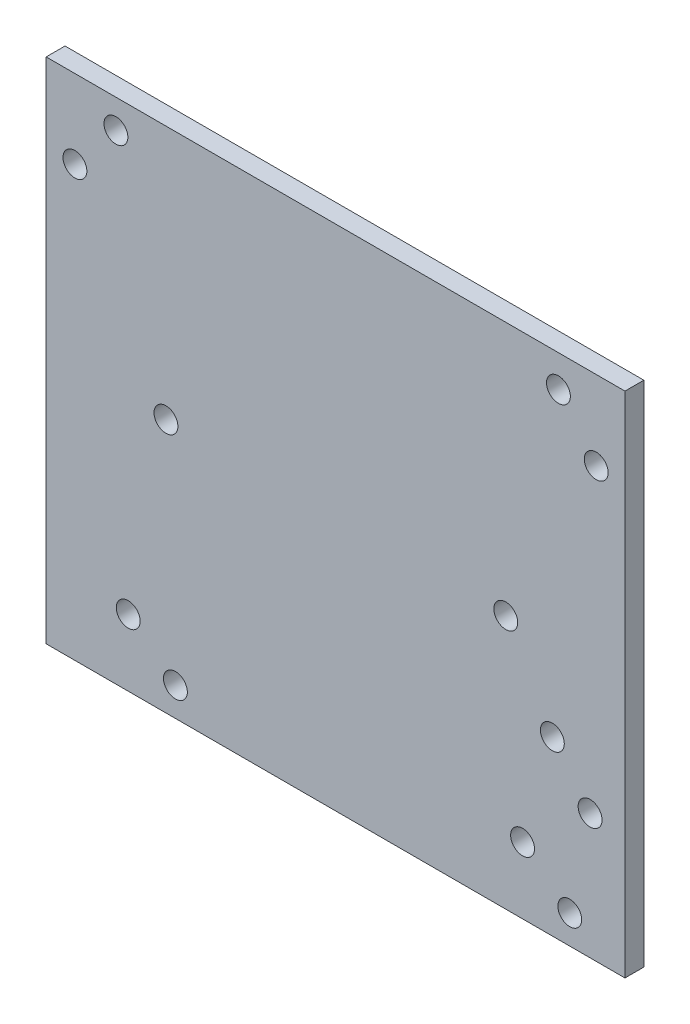
ISO-10303-21;
HEADER;
FILE_DESCRIPTION(('STEP AP214'),'2;1');
FILE_NAME('part.step','',(''),(''),'','','');
FILE_SCHEMA(('AUTOMOTIVE_DESIGN { 1 0 10303 214 1 1 1 1 }'));
ENDSEC;
DATA;
#1=APPLICATION_CONTEXT('core data for automotive mechanical design processes');
#2=APPLICATION_PROTOCOL_DEFINITION('international standard','automotive_design',2000,#1);
#3=PRODUCT_CONTEXT('',#1,'mechanical');
#4=PRODUCT('Part','Part','',(#3));
#5=PRODUCT_RELATED_PRODUCT_CATEGORY('part','',(#4));
#6=PRODUCT_DEFINITION_FORMATION('','',#4);
#7=PRODUCT_DEFINITION_CONTEXT('part definition',#1,'design');
#8=PRODUCT_DEFINITION('design','',#6,#7);
#9=PRODUCT_DEFINITION_SHAPE('','',#8);
#10=(LENGTH_UNIT() NAMED_UNIT(*) SI_UNIT(.MILLI.,.METRE.));
#11=(NAMED_UNIT(*) PLANE_ANGLE_UNIT() SI_UNIT($,.RADIAN.));
#12=(NAMED_UNIT(*) SI_UNIT($,.STERADIAN.) SOLID_ANGLE_UNIT());
#13=UNCERTAINTY_MEASURE_WITH_UNIT(LENGTH_MEASURE(1.E-05),#10,'distance_accuracy_value','');
#14=(GEOMETRIC_REPRESENTATION_CONTEXT(3) GLOBAL_UNCERTAINTY_ASSIGNED_CONTEXT((#13)) GLOBAL_UNIT_ASSIGNED_CONTEXT((#10,
#11,#12)) REPRESENTATION_CONTEXT('',''));
#15=CARTESIAN_POINT('',(0.,0.,0.));
#16=DIRECTION('',(0.,0.,1.));
#17=DIRECTION('',(1.,0.,0.));
#18=AXIS2_PLACEMENT_3D('',#15,#16,#17);
#19=CARTESIAN_POINT('',(0.,0.,-6.35));
#20=DIRECTION('',(0.,0.,1.));
#21=DIRECTION('',(-1.,0.,0.));
#22=AXIS2_PLACEMENT_3D('',#19,#20,#21);
#23=PLANE('',#22);
#24=DIRECTION('',(0.,-1.,0.));
#25=VECTOR('',#24,1.);
#26=CARTESIAN_POINT('',(862.044789876079,217.278265585855,-6.35));
#27=LINE('',#26,#25);
#28=CARTESIAN_POINT('',(862.044789876079,388.233207524856,-6.35));
#29=VERTEX_POINT('',#28);
#30=CARTESIAN_POINT('',(862.044789876079,217.278265585855,-6.35));
#31=VERTEX_POINT('',#30);
#32=EDGE_CURVE('E97',#29,#31,#27,.T.);
#33=ORIENTED_EDGE('',*,*,#32,.F.);
#34=DIRECTION('',(-1.,0.,0.));
#35=VECTOR('',#34,1.);
#36=CARTESIAN_POINT('',(862.044789876079,388.233207524856,-6.35));
#37=LINE('',#36,#35);
#38=CARTESIAN_POINT('',(1056.7178425293,388.233207524856,-6.35));
#39=VERTEX_POINT('',#38);
#40=EDGE_CURVE('E100',#39,#29,#37,.T.);
#41=ORIENTED_EDGE('',*,*,#40,.F.);
#42=DIRECTION('',(0.,1.,0.));
#43=VECTOR('',#42,1.);
#44=CARTESIAN_POINT('',(1056.7178425293,217.278265585855,-6.35));
#45=LINE('',#44,#43);
#46=CARTESIAN_POINT('',(1056.7178425293,217.278265585855,-6.35));
#47=VERTEX_POINT('',#46);
#48=EDGE_CURVE('E88',#47,#39,#45,.T.);
#49=ORIENTED_EDGE('',*,*,#48,.F.);
#50=DIRECTION('',(1.,0.,0.));
#51=VECTOR('',#50,1.);
#52=CARTESIAN_POINT('',(862.044789876079,217.278265585855,-6.35));
#53=LINE('',#52,#51);
#54=EDGE_CURVE('E93',#31,#47,#53,.T.);
#55=ORIENTED_EDGE('',*,*,#54,.F.);
#56=EDGE_LOOP('',(#33,#41,#49,#55));
#57=FACE_BOUND('',#56,.T.);
#58=CARTESIAN_POINT('',(1022.27995941321,239.653265585854,-6.35));
#59=DIRECTION('',(0.,0.,1.));
#60=DIRECTION('',(1.,0.,0.));
#61=AXIS2_PLACEMENT_3D('',#58,#59,#60);
#62=CIRCLE('',#61,4.01269999999996);
#63=CARTESIAN_POINT('',(1026.29265941321,239.653265585854,-6.35));
#64=VERTEX_POINT('',#63);
#65=EDGE_CURVE('E109',#64,#64,#62,.T.);
#66=ORIENTED_EDGE('',*,*,#65,.T.);
#67=EDGE_LOOP('',(#66));
#68=FACE_BOUND('',#67,.T.);
#69=CARTESIAN_POINT('',(1038.15495941321,226.953265585854,-6.35));
#70=DIRECTION('',(0.,0.,1.));
#71=DIRECTION('',(1.,0.,0.));
#72=AXIS2_PLACEMENT_3D('',#69,#70,#71);
#73=CIRCLE('',#72,4.01269999999996);
#74=CARTESIAN_POINT('',(1042.16765941321,226.953265585854,-6.35));
#75=VERTEX_POINT('',#74);
#76=EDGE_CURVE('E120',#75,#75,#73,.T.);
#77=ORIENTED_EDGE('',*,*,#76,.T.);
#78=EDGE_LOOP('',(#77));
#79=FACE_BOUND('',#78,.T.);
#80=CARTESIAN_POINT('',(889.644786871235,239.653265585855,-6.35));
#81=DIRECTION('',(0.,0.,1.));
#82=DIRECTION('',(1.,0.,0.));
#83=AXIS2_PLACEMENT_3D('',#80,#81,#82);
#84=CIRCLE('',#83,4.01270000000008);
#85=CARTESIAN_POINT('',(893.657486871235,239.653265585855,-6.35));
#86=VERTEX_POINT('',#85);
#87=EDGE_CURVE('E126',#86,#86,#84,.T.);
#88=ORIENTED_EDGE('',*,*,#87,.T.);
#89=EDGE_LOOP('',(#88));
#90=FACE_BOUND('',#89,.T.);
#91=CARTESIAN_POINT('',(1034.3338599261,377.480941448401,-6.35));
#92=DIRECTION('',(0.,0.,1.));
#93=DIRECTION('',(1.,0.,0.));
#94=AXIS2_PLACEMENT_3D('',#91,#92,#93);
#95=CIRCLE('',#94,4.01270000000019);
#96=CARTESIAN_POINT('',(1038.3465599261,377.480941448401,-6.35));
#97=VERTEX_POINT('',#96);
#98=EDGE_CURVE('E132',#97,#97,#95,.T.);
#99=ORIENTED_EDGE('',*,*,#98,.T.);
#100=EDGE_LOOP('',(#99));
#101=FACE_BOUND('',#100,.T.);
#102=CARTESIAN_POINT('',(1047.0428425293,361.613131700632,-6.35));
#103=DIRECTION('',(0.,0.,1.));
#104=DIRECTION('',(1.,0.,0.));
#105=AXIS2_PLACEMENT_3D('',#102,#103,#104);
#106=CIRCLE('',#105,4.01270000000019);
#107=CARTESIAN_POINT('',(1051.0555425293,361.613131700632,-6.35));
#108=VERTEX_POINT('',#107);
#109=EDGE_CURVE('E138',#108,#108,#106,.T.);
#110=ORIENTED_EDGE('',*,*,#109,.T.);
#111=EDGE_LOOP('',(#110));
#112=FACE_BOUND('',#111,.T.);
#113=CARTESIAN_POINT('',(871.719789876079,361.793284425073,-6.35));
#114=DIRECTION('',(0.,0.,1.));
#115=DIRECTION('',(1.,0.,0.));
#116=AXIS2_PLACEMENT_3D('',#113,#114,#115);
#117=CIRCLE('',#116,4.01270000000008);
#118=CARTESIAN_POINT('',(875.732489876079,361.793284425073,-6.35));
#119=VERTEX_POINT('',#118);
#120=EDGE_CURVE('E144',#119,#119,#117,.T.);
#121=ORIENTED_EDGE('',*,*,#120,.T.);
#122=EDGE_LOOP('',(#121));
#123=FACE_BOUND('',#122,.T.);
#124=CARTESIAN_POINT('',(885.505258453761,378.558207524856,-6.35));
#125=DIRECTION('',(0.,0.,1.));
#126=DIRECTION('',(1.,0.,0.));
#127=AXIS2_PLACEMENT_3D('',#124,#125,#126);
#128=CIRCLE('',#127,4.01270000000008);
#129=CARTESIAN_POINT('',(889.517958453761,378.558207524856,-6.35));
#130=VERTEX_POINT('',#129);
#131=EDGE_CURVE('E150',#130,#130,#128,.T.);
#132=ORIENTED_EDGE('',*,*,#131,.T.);
#133=EDGE_LOOP('',(#132));
#134=FACE_BOUND('',#133,.T.);
#135=CARTESIAN_POINT('',(905.519786871235,226.953265585855,-6.35));
#136=DIRECTION('',(0.,0.,1.));
#137=DIRECTION('',(1.,0.,0.));
#138=AXIS2_PLACEMENT_3D('',#135,#136,#137);
#139=CIRCLE('',#138,4.01270000000008);
#140=CARTESIAN_POINT('',(909.532486871235,226.953265585855,-6.35));
#141=VERTEX_POINT('',#140);
#142=EDGE_CURVE('E156',#141,#141,#139,.T.);
#143=ORIENTED_EDGE('',*,*,#142,.T.);
#144=EDGE_LOOP('',(#143));
#145=FACE_BOUND('',#144,.T.);
#146=CARTESIAN_POINT('',(902.338636268682,302.755736555355,-6.35));
#147=DIRECTION('',(0.,0.,1.));
#148=DIRECTION('',(1.,0.,0.));
#149=AXIS2_PLACEMENT_3D('',#146,#147,#148);
#150=CIRCLE('',#149,4.01270000000008);
#151=CARTESIAN_POINT('',(906.351336268682,302.755736555355,-6.35));
#152=VERTEX_POINT('',#151);
#153=EDGE_CURVE('E162',#152,#152,#150,.T.);
#154=ORIENTED_EDGE('',*,*,#153,.T.);
#155=EDGE_LOOP('',(#154));
#156=FACE_BOUND('',#155,.T.);
#157=CARTESIAN_POINT('',(1016.63863626868,302.755736555355,-6.35));
#158=DIRECTION('',(0.,0.,1.));
#159=DIRECTION('',(-1.,0.,0.));
#160=AXIS2_PLACEMENT_3D('',#157,#158,#159);
#161=CIRCLE('',#160,4.01270000000019);
#162=CARTESIAN_POINT('',(1012.62593626868,302.755736555355,-6.35));
#163=VERTEX_POINT('',#162);
#164=EDGE_CURVE('E168',#163,#163,#161,.T.);
#165=ORIENTED_EDGE('',*,*,#164,.T.);
#166=EDGE_LOOP('',(#165));
#167=FACE_BOUND('',#166,.T.);
#168=CARTESIAN_POINT('',(1032.28657507433,275.289465585855,-6.35));
#169=DIRECTION('',(0.,0.,1.));
#170=DIRECTION('',(1.,0.,0.));
#171=AXIS2_PLACEMENT_3D('',#168,#169,#170);
#172=CIRCLE('',#171,4.02539999999994);
#173=CARTESIAN_POINT('',(1036.31197507433,275.289465585855,-6.35));
#174=VERTEX_POINT('',#173);
#175=EDGE_CURVE('E174',#174,#174,#172,.T.);
#176=ORIENTED_EDGE('',*,*,#175,.T.);
#177=EDGE_LOOP('',(#176));
#178=FACE_BOUND('',#177,.T.);
#179=CARTESIAN_POINT('',(1044.98657507433,259.414465585855,-6.35));
#180=DIRECTION('',(0.,0.,1.));
#181=DIRECTION('',(1.,0.,0.));
#182=AXIS2_PLACEMENT_3D('',#179,#180,#181);
#183=CIRCLE('',#182,4.02539999999994);
#184=CARTESIAN_POINT('',(1049.01197507433,259.414465585855,-6.35));
#185=VERTEX_POINT('',#184);
#186=EDGE_CURVE('E180',#185,#185,#183,.T.);
#187=ORIENTED_EDGE('',*,*,#186,.T.);
#188=EDGE_LOOP('',(#187));
#189=FACE_BOUND('',#188,.T.);
#190=ADVANCED_FACE('F41',(#57,#68,#79,#90,#101,#112,#123,#134,#145,#156,#167,#178,#189),#23,.F.);
#191=CARTESIAN_POINT('',(0.,0.,0.));
#192=DIRECTION('',(0.,0.,1.));
#193=DIRECTION('',(-1.,0.,0.));
#194=AXIS2_PLACEMENT_3D('',#191,#192,#193);
#195=PLANE('',#194);
#196=CARTESIAN_POINT('',(1032.28657507433,275.289465585855,0.));
#197=DIRECTION('',(0.,0.,1.));
#198=DIRECTION('',(1.,0.,0.));
#199=AXIS2_PLACEMENT_3D('',#196,#197,#198);
#200=CIRCLE('',#199,4.02539999999994);
#201=CARTESIAN_POINT('',(1036.31197507433,275.289465585855,0.));
#202=VERTEX_POINT('',#201);
#203=EDGE_CURVE('E177',#202,#202,#200,.T.);
#204=ORIENTED_EDGE('',*,*,#203,.F.);
#205=EDGE_LOOP('',(#204));
#206=FACE_BOUND('',#205,.T.);
#207=CARTESIAN_POINT('',(902.338636268682,302.755736555355,0.));
#208=DIRECTION('',(0.,0.,1.));
#209=DIRECTION('',(1.,0.,0.));
#210=AXIS2_PLACEMENT_3D('',#207,#208,#209);
#211=CIRCLE('',#210,4.01270000000008);
#212=CARTESIAN_POINT('',(906.351336268682,302.755736555355,0.));
#213=VERTEX_POINT('',#212);
#214=EDGE_CURVE('E165',#213,#213,#211,.T.);
#215=ORIENTED_EDGE('',*,*,#214,.F.);
#216=EDGE_LOOP('',(#215));
#217=FACE_BOUND('',#216,.T.);
#218=CARTESIAN_POINT('',(885.505258453761,378.558207524856,0.));
#219=DIRECTION('',(0.,0.,1.));
#220=DIRECTION('',(1.,0.,0.));
#221=AXIS2_PLACEMENT_3D('',#218,#219,#220);
#222=CIRCLE('',#221,4.01270000000008);
#223=CARTESIAN_POINT('',(889.517958453761,378.558207524856,0.));
#224=VERTEX_POINT('',#223);
#225=EDGE_CURVE('E153',#224,#224,#222,.T.);
#226=ORIENTED_EDGE('',*,*,#225,.F.);
#227=EDGE_LOOP('',(#226));
#228=FACE_BOUND('',#227,.T.);
#229=CARTESIAN_POINT('',(1047.0428425293,361.613131700632,0.));
#230=DIRECTION('',(0.,0.,1.));
#231=DIRECTION('',(1.,0.,0.));
#232=AXIS2_PLACEMENT_3D('',#229,#230,#231);
#233=CIRCLE('',#232,4.01270000000019);
#234=CARTESIAN_POINT('',(1051.0555425293,361.613131700632,0.));
#235=VERTEX_POINT('',#234);
#236=EDGE_CURVE('E141',#235,#235,#233,.T.);
#237=ORIENTED_EDGE('',*,*,#236,.F.);
#238=EDGE_LOOP('',(#237));
#239=FACE_BOUND('',#238,.T.);
#240=CARTESIAN_POINT('',(889.644786871235,239.653265585855,0.));
#241=DIRECTION('',(0.,0.,1.));
#242=DIRECTION('',(1.,0.,0.));
#243=AXIS2_PLACEMENT_3D('',#240,#241,#242);
#244=CIRCLE('',#243,4.01270000000008);
#245=CARTESIAN_POINT('',(893.657486871235,239.653265585855,0.));
#246=VERTEX_POINT('',#245);
#247=EDGE_CURVE('E129',#246,#246,#244,.T.);
#248=ORIENTED_EDGE('',*,*,#247,.F.);
#249=EDGE_LOOP('',(#248));
#250=FACE_BOUND('',#249,.T.);
#251=CARTESIAN_POINT('',(1022.27995941321,239.653265585854,0.));
#252=DIRECTION('',(0.,0.,1.));
#253=DIRECTION('',(1.,0.,0.));
#254=AXIS2_PLACEMENT_3D('',#251,#252,#253);
#255=CIRCLE('',#254,4.01269999999996);
#256=CARTESIAN_POINT('',(1026.29265941321,239.653265585854,0.));
#257=VERTEX_POINT('',#256);
#258=EDGE_CURVE('E117',#257,#257,#255,.T.);
#259=ORIENTED_EDGE('',*,*,#258,.F.);
#260=EDGE_LOOP('',(#259));
#261=FACE_BOUND('',#260,.T.);
#262=DIRECTION('',(0.,-1.,0.));
#263=VECTOR('',#262,1.);
#264=CARTESIAN_POINT('',(862.044789876079,217.278265585855,0.));
#265=LINE('',#264,#263);
#266=CARTESIAN_POINT('',(862.044789876079,388.233207524856,0.));
#267=VERTEX_POINT('',#266);
#268=CARTESIAN_POINT('',(862.044789876079,217.278265585855,0.));
#269=VERTEX_POINT('',#268);
#270=EDGE_CURVE('E105',#267,#269,#265,.T.);
#271=ORIENTED_EDGE('',*,*,#270,.T.);
#272=DIRECTION('',(1.,0.,0.));
#273=VECTOR('',#272,1.);
#274=CARTESIAN_POINT('',(862.044789876079,217.278265585855,0.));
#275=LINE('',#274,#273);
#276=CARTESIAN_POINT('',(1056.7178425293,217.278265585855,0.));
#277=VERTEX_POINT('',#276);
#278=EDGE_CURVE('E108',#269,#277,#275,.T.);
#279=ORIENTED_EDGE('',*,*,#278,.T.);
#280=DIRECTION('',(0.,1.,0.));
#281=VECTOR('',#280,1.);
#282=CARTESIAN_POINT('',(1056.7178425293,217.278265585855,0.));
#283=LINE('',#282,#281);
#284=CARTESIAN_POINT('',(1056.7178425293,388.233207524856,0.));
#285=VERTEX_POINT('',#284);
#286=EDGE_CURVE('E91',#277,#285,#283,.T.);
#287=ORIENTED_EDGE('',*,*,#286,.T.);
#288=DIRECTION('',(-1.,0.,0.));
#289=VECTOR('',#288,1.);
#290=CARTESIAN_POINT('',(862.044789876079,388.233207524856,0.));
#291=LINE('',#290,#289);
#292=EDGE_CURVE('E112',#285,#267,#291,.T.);
#293=ORIENTED_EDGE('',*,*,#292,.T.);
#294=EDGE_LOOP('',(#271,#279,#287,#293));
#295=FACE_BOUND('',#294,.T.);
#296=CARTESIAN_POINT('',(1038.15495941321,226.953265585854,0.));
#297=DIRECTION('',(0.,0.,1.));
#298=DIRECTION('',(1.,0.,0.));
#299=AXIS2_PLACEMENT_3D('',#296,#297,#298);
#300=CIRCLE('',#299,4.01269999999996);
#301=CARTESIAN_POINT('',(1042.16765941321,226.953265585854,0.));
#302=VERTEX_POINT('',#301);
#303=EDGE_CURVE('E123',#302,#302,#300,.T.);
#304=ORIENTED_EDGE('',*,*,#303,.F.);
#305=EDGE_LOOP('',(#304));
#306=FACE_BOUND('',#305,.T.);
#307=CARTESIAN_POINT('',(1034.3338599261,377.480941448401,0.));
#308=DIRECTION('',(0.,0.,1.));
#309=DIRECTION('',(1.,0.,0.));
#310=AXIS2_PLACEMENT_3D('',#307,#308,#309);
#311=CIRCLE('',#310,4.01270000000019);
#312=CARTESIAN_POINT('',(1038.3465599261,377.480941448401,0.));
#313=VERTEX_POINT('',#312);
#314=EDGE_CURVE('E135',#313,#313,#311,.T.);
#315=ORIENTED_EDGE('',*,*,#314,.F.);
#316=EDGE_LOOP('',(#315));
#317=FACE_BOUND('',#316,.T.);
#318=CARTESIAN_POINT('',(871.719789876079,361.793284425073,0.));
#319=DIRECTION('',(0.,0.,1.));
#320=DIRECTION('',(1.,0.,0.));
#321=AXIS2_PLACEMENT_3D('',#318,#319,#320);
#322=CIRCLE('',#321,4.01270000000008);
#323=CARTESIAN_POINT('',(875.732489876079,361.793284425073,0.));
#324=VERTEX_POINT('',#323);
#325=EDGE_CURVE('E147',#324,#324,#322,.T.);
#326=ORIENTED_EDGE('',*,*,#325,.F.);
#327=EDGE_LOOP('',(#326));
#328=FACE_BOUND('',#327,.T.);
#329=CARTESIAN_POINT('',(905.519786871235,226.953265585855,0.));
#330=DIRECTION('',(0.,0.,1.));
#331=DIRECTION('',(1.,0.,0.));
#332=AXIS2_PLACEMENT_3D('',#329,#330,#331);
#333=CIRCLE('',#332,4.01270000000008);
#334=CARTESIAN_POINT('',(909.532486871235,226.953265585855,0.));
#335=VERTEX_POINT('',#334);
#336=EDGE_CURVE('E159',#335,#335,#333,.T.);
#337=ORIENTED_EDGE('',*,*,#336,.F.);
#338=EDGE_LOOP('',(#337));
#339=FACE_BOUND('',#338,.T.);
#340=CARTESIAN_POINT('',(1016.63863626868,302.755736555355,0.));
#341=DIRECTION('',(0.,0.,1.));
#342=DIRECTION('',(-1.,0.,0.));
#343=AXIS2_PLACEMENT_3D('',#340,#341,#342);
#344=CIRCLE('',#343,4.01270000000019);
#345=CARTESIAN_POINT('',(1012.62593626868,302.755736555355,0.));
#346=VERTEX_POINT('',#345);
#347=EDGE_CURVE('E171',#346,#346,#344,.T.);
#348=ORIENTED_EDGE('',*,*,#347,.F.);
#349=EDGE_LOOP('',(#348));
#350=FACE_BOUND('',#349,.T.);
#351=CARTESIAN_POINT('',(1044.98657507433,259.414465585855,0.));
#352=DIRECTION('',(0.,0.,1.));
#353=DIRECTION('',(1.,0.,0.));
#354=AXIS2_PLACEMENT_3D('',#351,#352,#353);
#355=CIRCLE('',#354,4.02539999999994);
#356=CARTESIAN_POINT('',(1049.01197507433,259.414465585855,0.));
#357=VERTEX_POINT('',#356);
#358=EDGE_CURVE('E183',#357,#357,#355,.T.);
#359=ORIENTED_EDGE('',*,*,#358,.F.);
#360=EDGE_LOOP('',(#359));
#361=FACE_BOUND('',#360,.T.);
#362=ADVANCED_FACE('F197',(#206,#217,#228,#239,#250,#261,#295,#306,#317,#328,#339,#350,#361),
#195,.T.);
#363=CARTESIAN_POINT('',(862.044789876079,217.278265585855,-6.35));
#364=DIRECTION('',(1.,0.,0.));
#365=DIRECTION('',(0.,0.,1.));
#366=AXIS2_PLACEMENT_3D('',#363,#364,#365);
#367=PLANE('',#366);
#368=ORIENTED_EDGE('',*,*,#270,.F.);
#369=DIRECTION('',(0.,0.,1.));
#370=VECTOR('',#369,1.);
#371=CARTESIAN_POINT('',(862.044789876079,388.233207524856,-6.35));
#372=LINE('',#371,#370);
#373=EDGE_CURVE('E58',#29,#267,#372,.T.);
#374=ORIENTED_EDGE('',*,*,#373,.F.);
#375=ORIENTED_EDGE('',*,*,#32,.T.);
#376=DIRECTION('',(0.,0.,1.));
#377=VECTOR('',#376,1.);
#378=CARTESIAN_POINT('',(862.044789876079,217.278265585855,-6.35));
#379=LINE('',#378,#377);
#380=EDGE_CURVE('E11',#31,#269,#379,.T.);
#381=ORIENTED_EDGE('',*,*,#380,.T.);
#382=EDGE_LOOP('',(#368,#374,#375,#381));
#383=FACE_BOUND('',#382,.T.);
#384=ADVANCED_FACE('F43',(#383),#367,.F.);
#385=CARTESIAN_POINT('',(862.044789876079,217.278265585855,-6.35));
#386=DIRECTION('',(0.,1.,0.));
#387=DIRECTION('',(0.,0.,-1.));
#388=AXIS2_PLACEMENT_3D('',#385,#386,#387);
#389=PLANE('',#388);
#390=ORIENTED_EDGE('',*,*,#278,.F.);
#391=ORIENTED_EDGE('',*,*,#380,.F.);
#392=ORIENTED_EDGE('',*,*,#54,.T.);
#393=DIRECTION('',(0.,0.,1.));
#394=VECTOR('',#393,1.);
#395=CARTESIAN_POINT('',(1056.7178425293,217.278265585855,-6.35));
#396=LINE('',#395,#394);
#397=EDGE_CURVE('E50',#47,#277,#396,.T.);
#398=ORIENTED_EDGE('',*,*,#397,.T.);
#399=EDGE_LOOP('',(#390,#391,#392,#398));
#400=FACE_BOUND('',#399,.T.);
#401=ADVANCED_FACE('F94',(#400),#389,.F.);
#402=CARTESIAN_POINT('',(1056.7178425293,217.278265585855,-6.35));
#403=DIRECTION('',(-1.,0.,0.));
#404=DIRECTION('',(0.,0.,-1.));
#405=AXIS2_PLACEMENT_3D('',#402,#403,#404);
#406=PLANE('',#405);
#407=ORIENTED_EDGE('',*,*,#286,.F.);
#408=ORIENTED_EDGE('',*,*,#397,.F.);
#409=ORIENTED_EDGE('',*,*,#48,.T.);
#410=DIRECTION('',(0.,0.,1.));
#411=VECTOR('',#410,1.);
#412=CARTESIAN_POINT('',(1056.7178425293,388.233207524856,-6.35));
#413=LINE('',#412,#411);
#414=EDGE_CURVE('E74',#39,#285,#413,.T.);
#415=ORIENTED_EDGE('',*,*,#414,.T.);
#416=EDGE_LOOP('',(#407,#408,#409,#415));
#417=FACE_BOUND('',#416,.T.);
#418=ADVANCED_FACE('F86',(#417),#406,.F.);
#419=CARTESIAN_POINT('',(862.044789876079,388.233207524856,-6.35));
#420=DIRECTION('',(0.,-1.,0.));
#421=DIRECTION('',(0.,0.,1.));
#422=AXIS2_PLACEMENT_3D('',#419,#420,#421);
#423=PLANE('',#422);
#424=ORIENTED_EDGE('',*,*,#292,.F.);
#425=ORIENTED_EDGE('',*,*,#414,.F.);
#426=ORIENTED_EDGE('',*,*,#40,.T.);
#427=ORIENTED_EDGE('',*,*,#373,.T.);
#428=EDGE_LOOP('',(#424,#425,#426,#427));
#429=FACE_BOUND('',#428,.T.);
#430=ADVANCED_FACE('F210',(#429),#423,.F.);
#431=CARTESIAN_POINT('',(1022.27995941321,239.653265585854,-6.35));
#432=DIRECTION('',(0.,0.,1.));
#433=DIRECTION('',(-1.,0.,0.));
#434=AXIS2_PLACEMENT_3D('',#431,#432,#433);
#435=CYLINDRICAL_SURFACE('',#434,4.01269999999996);
#436=ORIENTED_EDGE('',*,*,#65,.F.);
#437=EDGE_LOOP('',(#436));
#438=FACE_BOUND('',#437,.T.);
#439=ORIENTED_EDGE('',*,*,#258,.T.);
#440=EDGE_LOOP('',(#439));
#441=FACE_BOUND('',#440,.T.);
#442=ADVANCED_FACE('F213',(#438,#441),#435,.F.);
#443=CARTESIAN_POINT('',(1038.15495941321,226.953265585854,-6.35));
#444=DIRECTION('',(0.,0.,1.));
#445=DIRECTION('',(-1.,0.,0.));
#446=AXIS2_PLACEMENT_3D('',#443,#444,#445);
#447=CYLINDRICAL_SURFACE('',#446,4.01269999999996);
#448=ORIENTED_EDGE('',*,*,#76,.F.);
#449=EDGE_LOOP('',(#448));
#450=FACE_BOUND('',#449,.T.);
#451=ORIENTED_EDGE('',*,*,#303,.T.);
#452=EDGE_LOOP('',(#451));
#453=FACE_BOUND('',#452,.T.);
#454=ADVANCED_FACE('F237',(#450,#453),#447,.F.);
#455=CARTESIAN_POINT('',(889.644786871235,239.653265585855,-6.35));
#456=DIRECTION('',(0.,0.,1.));
#457=DIRECTION('',(-1.,0.,0.));
#458=AXIS2_PLACEMENT_3D('',#455,#456,#457);
#459=CYLINDRICAL_SURFACE('',#458,4.01270000000008);
#460=ORIENTED_EDGE('',*,*,#87,.F.);
#461=EDGE_LOOP('',(#460));
#462=FACE_BOUND('',#461,.T.);
#463=ORIENTED_EDGE('',*,*,#247,.T.);
#464=EDGE_LOOP('',(#463));
#465=FACE_BOUND('',#464,.T.);
#466=ADVANCED_FACE('F245',(#462,#465),#459,.F.);
#467=CARTESIAN_POINT('',(1034.3338599261,377.480941448401,-6.35));
#468=DIRECTION('',(0.,0.,1.));
#469=DIRECTION('',(-1.,0.,0.));
#470=AXIS2_PLACEMENT_3D('',#467,#468,#469);
#471=CYLINDRICAL_SURFACE('',#470,4.01270000000019);
#472=ORIENTED_EDGE('',*,*,#98,.F.);
#473=EDGE_LOOP('',(#472));
#474=FACE_BOUND('',#473,.T.);
#475=ORIENTED_EDGE('',*,*,#314,.T.);
#476=EDGE_LOOP('',(#475));
#477=FACE_BOUND('',#476,.T.);
#478=ADVANCED_FACE('F254',(#474,#477),#471,.F.);
#479=CARTESIAN_POINT('',(1047.0428425293,361.613131700632,-6.35));
#480=DIRECTION('',(0.,0.,1.));
#481=DIRECTION('',(-1.,0.,0.));
#482=AXIS2_PLACEMENT_3D('',#479,#480,#481);
#483=CYLINDRICAL_SURFACE('',#482,4.01270000000019);
#484=ORIENTED_EDGE('',*,*,#109,.F.);
#485=EDGE_LOOP('',(#484));
#486=FACE_BOUND('',#485,.T.);
#487=ORIENTED_EDGE('',*,*,#236,.T.);
#488=EDGE_LOOP('',(#487));
#489=FACE_BOUND('',#488,.T.);
#490=ADVANCED_FACE('F263',(#486,#489),#483,.F.);
#491=CARTESIAN_POINT('',(871.719789876079,361.793284425073,-6.35));
#492=DIRECTION('',(0.,0.,1.));
#493=DIRECTION('',(-1.,0.,0.));
#494=AXIS2_PLACEMENT_3D('',#491,#492,#493);
#495=CYLINDRICAL_SURFACE('',#494,4.01270000000008);
#496=ORIENTED_EDGE('',*,*,#120,.F.);
#497=EDGE_LOOP('',(#496));
#498=FACE_BOUND('',#497,.T.);
#499=ORIENTED_EDGE('',*,*,#325,.T.);
#500=EDGE_LOOP('',(#499));
#501=FACE_BOUND('',#500,.T.);
#502=ADVANCED_FACE('F272',(#498,#501),#495,.F.);
#503=CARTESIAN_POINT('',(885.505258453761,378.558207524856,-6.35));
#504=DIRECTION('',(0.,0.,1.));
#505=DIRECTION('',(-1.,0.,0.));
#506=AXIS2_PLACEMENT_3D('',#503,#504,#505);
#507=CYLINDRICAL_SURFACE('',#506,4.01270000000008);
#508=ORIENTED_EDGE('',*,*,#131,.F.);
#509=EDGE_LOOP('',(#508));
#510=FACE_BOUND('',#509,.T.);
#511=ORIENTED_EDGE('',*,*,#225,.T.);
#512=EDGE_LOOP('',(#511));
#513=FACE_BOUND('',#512,.T.);
#514=ADVANCED_FACE('F281',(#510,#513),#507,.F.);
#515=CARTESIAN_POINT('',(905.519786871235,226.953265585855,-6.35));
#516=DIRECTION('',(0.,0.,1.));
#517=DIRECTION('',(-1.,0.,0.));
#518=AXIS2_PLACEMENT_3D('',#515,#516,#517);
#519=CYLINDRICAL_SURFACE('',#518,4.01270000000008);
#520=ORIENTED_EDGE('',*,*,#142,.F.);
#521=EDGE_LOOP('',(#520));
#522=FACE_BOUND('',#521,.T.);
#523=ORIENTED_EDGE('',*,*,#336,.T.);
#524=EDGE_LOOP('',(#523));
#525=FACE_BOUND('',#524,.T.);
#526=ADVANCED_FACE('F290',(#522,#525),#519,.F.);
#527=CARTESIAN_POINT('',(902.338636268682,302.755736555355,-6.35));
#528=DIRECTION('',(0.,0.,1.));
#529=DIRECTION('',(-1.,0.,0.));
#530=AXIS2_PLACEMENT_3D('',#527,#528,#529);
#531=CYLINDRICAL_SURFACE('',#530,4.01270000000008);
#532=ORIENTED_EDGE('',*,*,#153,.F.);
#533=EDGE_LOOP('',(#532));
#534=FACE_BOUND('',#533,.T.);
#535=ORIENTED_EDGE('',*,*,#214,.T.);
#536=EDGE_LOOP('',(#535));
#537=FACE_BOUND('',#536,.T.);
#538=ADVANCED_FACE('F299',(#534,#537),#531,.F.);
#539=CARTESIAN_POINT('',(1016.63863626868,302.755736555355,-6.35));
#540=DIRECTION('',(0.,0.,1.));
#541=DIRECTION('',(-1.,0.,0.));
#542=AXIS2_PLACEMENT_3D('',#539,#540,#541);
#543=CYLINDRICAL_SURFACE('',#542,4.01270000000019);
#544=ORIENTED_EDGE('',*,*,#164,.F.);
#545=EDGE_LOOP('',(#544));
#546=FACE_BOUND('',#545,.T.);
#547=ORIENTED_EDGE('',*,*,#347,.T.);
#548=EDGE_LOOP('',(#547));
#549=FACE_BOUND('',#548,.T.);
#550=ADVANCED_FACE('F308',(#546,#549),#543,.F.);
#551=CARTESIAN_POINT('',(1032.28657507433,275.289465585855,-6.35));
#552=DIRECTION('',(0.,0.,1.));
#553=DIRECTION('',(-1.,0.,0.));
#554=AXIS2_PLACEMENT_3D('',#551,#552,#553);
#555=CYLINDRICAL_SURFACE('',#554,4.02539999999994);
#556=ORIENTED_EDGE('',*,*,#175,.F.);
#557=EDGE_LOOP('',(#556));
#558=FACE_BOUND('',#557,.T.);
#559=ORIENTED_EDGE('',*,*,#203,.T.);
#560=EDGE_LOOP('',(#559));
#561=FACE_BOUND('',#560,.T.);
#562=ADVANCED_FACE('F193',(#558,#561),#555,.F.);
#563=CARTESIAN_POINT('',(1044.98657507433,259.414465585855,-6.35));
#564=DIRECTION('',(0.,0.,1.));
#565=DIRECTION('',(-1.,0.,0.));
#566=AXIS2_PLACEMENT_3D('',#563,#564,#565);
#567=CYLINDRICAL_SURFACE('',#566,4.02539999999994);
#568=ORIENTED_EDGE('',*,*,#186,.F.);
#569=EDGE_LOOP('',(#568));
#570=FACE_BOUND('',#569,.T.);
#571=ORIENTED_EDGE('',*,*,#358,.T.);
#572=EDGE_LOOP('',(#571));
#573=FACE_BOUND('',#572,.T.);
#574=ADVANCED_FACE('F190',(#570,#573),#567,.F.);
#575=CLOSED_SHELL('',(#190,#362,#384,#401,#418,#430,#442,#454,#466,#478,#490,#502,#514,#526,
#538,#550,#562,#574));
#576=MANIFOLD_SOLID_BREP('B2',#575);
#577=ADVANCED_BREP_SHAPE_REPRESENTATION('',(#18,#576),#14);
#578=SHAPE_DEFINITION_REPRESENTATION(#9,#577);
ENDSEC;
END-ISO-10303-21;
